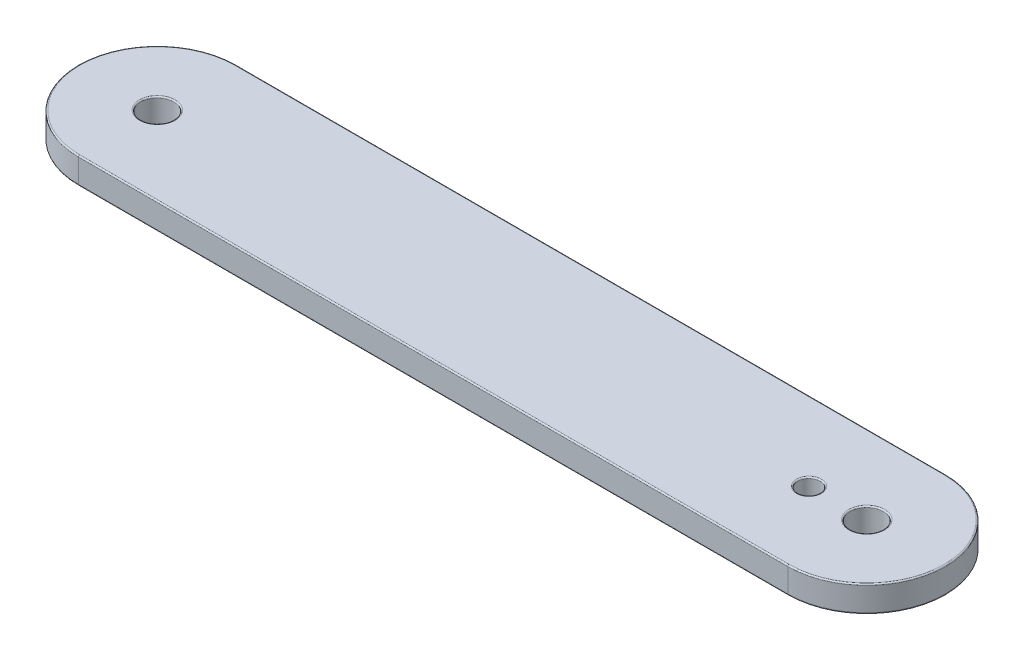
ISO-10303-21;
HEADER;
FILE_DESCRIPTION(('STEP AP214'),'2;1');
FILE_NAME('part.step','',(''),(''),'','','');
FILE_SCHEMA(('AUTOMOTIVE_DESIGN { 1 0 10303 214 1 1 1 1 }'));
ENDSEC;
DATA;
#1=APPLICATION_CONTEXT('core data for automotive mechanical design processes');
#2=APPLICATION_PROTOCOL_DEFINITION('international standard','automotive_design',2000,#1);
#3=PRODUCT_CONTEXT('',#1,'mechanical');
#4=PRODUCT('Part','Part','',(#3));
#5=PRODUCT_RELATED_PRODUCT_CATEGORY('part','',(#4));
#6=PRODUCT_DEFINITION_FORMATION('','',#4);
#7=PRODUCT_DEFINITION_CONTEXT('part definition',#1,'design');
#8=PRODUCT_DEFINITION('design','',#6,#7);
#9=PRODUCT_DEFINITION_SHAPE('','',#8);
#10=(LENGTH_UNIT() NAMED_UNIT(*) SI_UNIT(.MILLI.,.METRE.));
#11=(NAMED_UNIT(*) PLANE_ANGLE_UNIT() SI_UNIT($,.RADIAN.));
#12=(NAMED_UNIT(*) SI_UNIT($,.STERADIAN.) SOLID_ANGLE_UNIT());
#13=UNCERTAINTY_MEASURE_WITH_UNIT(LENGTH_MEASURE(1.E-05),#10,'distance_accuracy_value','');
#14=(GEOMETRIC_REPRESENTATION_CONTEXT(3) GLOBAL_UNCERTAINTY_ASSIGNED_CONTEXT((#13)) GLOBAL_UNIT_ASSIGNED_CONTEXT((#10,
#11,#12)) REPRESENTATION_CONTEXT('',''));
#15=CARTESIAN_POINT('',(0.,0.,0.));
#16=DIRECTION('',(0.,0.,1.));
#17=DIRECTION('',(1.,0.,0.));
#18=AXIS2_PLACEMENT_3D('',#15,#16,#17);
#19=CARTESIAN_POINT('',(0.,6.35,0.));
#20=DIRECTION('',(0.,1.,0.));
#21=DIRECTION('',(0.,0.,1.));
#22=AXIS2_PLACEMENT_3D('',#19,#20,#21);
#23=PLANE('',#22);
#24=CARTESIAN_POINT('',(-13.97,6.35,0.));
#25=DIRECTION('',(0.,1.,0.));
#26=DIRECTION('',(0.,0.,1.));
#27=AXIS2_PLACEMENT_3D('',#24,#25,#26);
#28=CIRCLE('',#27,3.0175);
#29=CARTESIAN_POINT('',(-13.97,6.35,3.0175));
#30=VERTEX_POINT('',#29);
#31=EDGE_CURVE('E130',#30,#30,#28,.F.);
#32=ORIENTED_EDGE('',*,*,#31,.T.);
#33=EDGE_LOOP('',(#32));
#34=FACE_BOUND('',#33,.T.);
#35=CARTESIAN_POINT('',(-171.45,6.35,0.));
#36=DIRECTION('',(0.,1.,0.));
#37=DIRECTION('',(0.,0.,1.));
#38=AXIS2_PLACEMENT_3D('',#35,#36,#37);
#39=CIRCLE('',#38,4.31749999999999);
#40=CARTESIAN_POINT('',(-171.45,6.35,4.31749999999999));
#41=VERTEX_POINT('',#40);
#42=EDGE_CURVE('E127',#41,#41,#39,.F.);
#43=ORIENTED_EDGE('',*,*,#42,.T.);
#44=EDGE_LOOP('',(#43));
#45=FACE_BOUND('',#44,.T.);
#46=CARTESIAN_POINT('',(-171.45,6.35,0.));
#47=DIRECTION('',(0.,1.,0.));
#48=DIRECTION('',(0.,0.,1.));
#49=AXIS2_PLACEMENT_3D('',#46,#47,#48);
#50=CIRCLE('',#49,18.7325);
#51=CARTESIAN_POINT('',(-171.45,6.35,-18.7325));
#52=VERTEX_POINT('',#51);
#53=CARTESIAN_POINT('',(-171.45,6.35,18.7325));
#54=VERTEX_POINT('',#53);
#55=EDGE_CURVE('E125',#52,#54,#50,.T.);
#56=ORIENTED_EDGE('',*,*,#55,.T.);
#57=DIRECTION('',(1.,0.,0.));
#58=VECTOR('',#57,1.);
#59=CARTESIAN_POINT('',(0.,6.35,18.7325));
#60=LINE('',#59,#58);
#61=CARTESIAN_POINT('',(0.,6.35,18.7325));
#62=VERTEX_POINT('',#61);
#63=EDGE_CURVE('E106',#54,#62,#60,.T.);
#64=ORIENTED_EDGE('',*,*,#63,.T.);
#65=CARTESIAN_POINT('',(0.,6.35,0.));
#66=DIRECTION('',(0.,1.,0.));
#67=DIRECTION('',(0.,0.,1.));
#68=AXIS2_PLACEMENT_3D('',#65,#66,#67);
#69=CIRCLE('',#68,18.7325);
#70=CARTESIAN_POINT('',(0.,6.35,-18.7325));
#71=VERTEX_POINT('',#70);
#72=EDGE_CURVE('E114',#62,#71,#69,.T.);
#73=ORIENTED_EDGE('',*,*,#72,.T.);
#74=DIRECTION('',(-1.,0.,0.));
#75=VECTOR('',#74,1.);
#76=CARTESIAN_POINT('',(-171.45,6.35,-18.7325));
#77=LINE('',#76,#75);
#78=EDGE_CURVE('E120',#71,#52,#77,.T.);
#79=ORIENTED_EDGE('',*,*,#78,.T.);
#80=EDGE_LOOP('',(#56,#64,#73,#79));
#81=FACE_BOUND('',#80,.T.);
#82=CARTESIAN_POINT('',(0.,6.35,0.));
#83=DIRECTION('',(0.,1.,0.));
#84=DIRECTION('',(0.,0.,1.));
#85=AXIS2_PLACEMENT_3D('',#82,#83,#84);
#86=CIRCLE('',#85,4.3175);
#87=CARTESIAN_POINT('',(0.,6.35,4.3175));
#88=VERTEX_POINT('',#87);
#89=EDGE_CURVE('E121',#88,#88,#86,.F.);
#90=ORIENTED_EDGE('',*,*,#89,.T.);
#91=EDGE_LOOP('',(#90));
#92=FACE_BOUND('',#91,.T.);
#93=ADVANCED_FACE('F34',(#34,#45,#81,#92),#23,.T.);
#94=CARTESIAN_POINT('',(0.,0.,0.));
#95=DIRECTION('',(0.,1.,0.));
#96=DIRECTION('',(0.,0.,1.));
#97=AXIS2_PLACEMENT_3D('',#94,#95,#96);
#98=PLANE('',#97);
#99=CARTESIAN_POINT('',(-13.97,0.,0.));
#100=DIRECTION('',(0.,1.,0.));
#101=DIRECTION('',(0.,0.,1.));
#102=AXIS2_PLACEMENT_3D('',#99,#100,#101);
#103=CIRCLE('',#102,3.0175);
#104=CARTESIAN_POINT('',(-13.97,0.,3.0175));
#105=VERTEX_POINT('',#104);
#106=EDGE_CURVE('E11',#105,#105,#103,.T.);
#107=ORIENTED_EDGE('',*,*,#106,.T.);
#108=EDGE_LOOP('',(#107));
#109=FACE_BOUND('',#108,.T.);
#110=CARTESIAN_POINT('',(0.,0.,0.));
#111=DIRECTION('',(0.,1.,0.));
#112=DIRECTION('',(0.,0.,1.));
#113=AXIS2_PLACEMENT_3D('',#110,#111,#112);
#114=CIRCLE('',#113,4.3175);
#115=CARTESIAN_POINT('',(0.,0.,4.3175));
#116=VERTEX_POINT('',#115);
#117=EDGE_CURVE('E43',#116,#116,#114,.T.);
#118=ORIENTED_EDGE('',*,*,#117,.T.);
#119=EDGE_LOOP('',(#118));
#120=FACE_BOUND('',#119,.T.);
#121=CARTESIAN_POINT('',(-171.45,0.,0.));
#122=DIRECTION('',(0.,1.,0.));
#123=DIRECTION('',(0.,0.,1.));
#124=AXIS2_PLACEMENT_3D('',#121,#122,#123);
#125=CIRCLE('',#124,4.31749999999999);
#126=CARTESIAN_POINT('',(-171.45,0.,4.31749999999999));
#127=VERTEX_POINT('',#126);
#128=EDGE_CURVE('E171',#127,#127,#125,.T.);
#129=ORIENTED_EDGE('',*,*,#128,.T.);
#130=EDGE_LOOP('',(#129));
#131=FACE_BOUND('',#130,.T.);
#132=CARTESIAN_POINT('',(-171.45,0.,0.));
#133=DIRECTION('',(0.,1.,0.));
#134=DIRECTION('',(0.,0.,1.));
#135=AXIS2_PLACEMENT_3D('',#132,#133,#134);
#136=CIRCLE('',#135,18.7325);
#137=CARTESIAN_POINT('',(-171.45,0.,18.7325));
#138=VERTEX_POINT('',#137);
#139=CARTESIAN_POINT('',(-171.45,0.,-18.7325));
#140=VERTEX_POINT('',#139);
#141=EDGE_CURVE('E51',#138,#140,#136,.F.);
#142=ORIENTED_EDGE('',*,*,#141,.T.);
#143=DIRECTION('',(-1.,0.,0.));
#144=VECTOR('',#143,1.);
#145=CARTESIAN_POINT('',(0.,0.,-18.7325));
#146=LINE('',#145,#144);
#147=CARTESIAN_POINT('',(0.,0.,-18.7325));
#148=VERTEX_POINT('',#147);
#149=EDGE_CURVE('E169',#140,#148,#146,.F.);
#150=ORIENTED_EDGE('',*,*,#149,.T.);
#151=CARTESIAN_POINT('',(0.,0.,0.));
#152=DIRECTION('',(0.,1.,0.));
#153=DIRECTION('',(0.,0.,1.));
#154=AXIS2_PLACEMENT_3D('',#151,#152,#153);
#155=CIRCLE('',#154,18.7325);
#156=CARTESIAN_POINT('',(0.,0.,18.7325));
#157=VERTEX_POINT('',#156);
#158=EDGE_CURVE('E165',#148,#157,#155,.F.);
#159=ORIENTED_EDGE('',*,*,#158,.T.);
#160=DIRECTION('',(1.,0.,0.));
#161=VECTOR('',#160,1.);
#162=CARTESIAN_POINT('',(0.,0.,18.7325));
#163=LINE('',#162,#161);
#164=EDGE_CURVE('E56',#157,#138,#163,.F.);
#165=ORIENTED_EDGE('',*,*,#164,.T.);
#166=EDGE_LOOP('',(#142,#150,#159,#165));
#167=FACE_BOUND('',#166,.T.);
#168=ADVANCED_FACE('F203',(#109,#120,#131,#167),#98,.F.);
#169=CARTESIAN_POINT('',(0.,6.35,0.));
#170=DIRECTION('',(0.,-1.,0.));
#171=DIRECTION('',(0.,0.,-1.));
#172=AXIS2_PLACEMENT_3D('',#169,#170,#171);
#173=CYLINDRICAL_SURFACE('',#172,19.05);
#174=DIRECTION('',(0.,-1.,0.));
#175=VECTOR('',#174,1.);
#176=CARTESIAN_POINT('',(0.,6.35,-19.05));
#177=LINE('',#176,#175);
#178=CARTESIAN_POINT('',(0.,6.0325,-19.05));
#179=VERTEX_POINT('',#178);
#180=CARTESIAN_POINT('',(0.,0.3175,-19.05));
#181=VERTEX_POINT('',#180);
#182=EDGE_CURVE('E439',#179,#181,#177,.T.);
#183=ORIENTED_EDGE('',*,*,#182,.F.);
#184=CARTESIAN_POINT('',(0.,6.0325,0.));
#185=DIRECTION('',(0.,1.,0.));
#186=DIRECTION('',(0.,0.,1.));
#187=AXIS2_PLACEMENT_3D('',#184,#185,#186);
#188=CIRCLE('',#187,19.05);
#189=CARTESIAN_POINT('',(0.,6.0325,19.05));
#190=VERTEX_POINT('',#189);
#191=EDGE_CURVE('E157',#179,#190,#188,.F.);
#192=ORIENTED_EDGE('',*,*,#191,.T.);
#193=DIRECTION('',(0.,-1.,0.));
#194=VECTOR('',#193,1.);
#195=CARTESIAN_POINT('',(0.,6.35,19.05));
#196=LINE('',#195,#194);
#197=CARTESIAN_POINT('',(0.,0.3175,19.05));
#198=VERTEX_POINT('',#197);
#199=EDGE_CURVE('E181',#190,#198,#196,.T.);
#200=ORIENTED_EDGE('',*,*,#199,.T.);
#201=CARTESIAN_POINT('',(0.,0.3175,0.));
#202=DIRECTION('',(0.,1.,0.));
#203=DIRECTION('',(0.,0.,1.));
#204=AXIS2_PLACEMENT_3D('',#201,#202,#203);
#205=CIRCLE('',#204,19.05);
#206=EDGE_CURVE('E155',#198,#181,#205,.T.);
#207=ORIENTED_EDGE('',*,*,#206,.T.);
#208=EDGE_LOOP('',(#183,#192,#200,#207));
#209=FACE_BOUND('',#208,.T.);
#210=ADVANCED_FACE('F205',(#209),#173,.T.);
#211=CARTESIAN_POINT('',(0.,6.35,-19.05));
#212=DIRECTION('',(0.,0.,1.));
#213=DIRECTION('',(1.,0.,0.));
#214=AXIS2_PLACEMENT_3D('',#211,#212,#213);
#215=PLANE('',#214);
#216=DIRECTION('',(0.,-1.,0.));
#217=VECTOR('',#216,1.);
#218=CARTESIAN_POINT('',(-171.45,6.35,-19.05));
#219=LINE('',#218,#217);
#220=CARTESIAN_POINT('',(-171.45,6.0325,-19.05));
#221=VERTEX_POINT('',#220);
#222=CARTESIAN_POINT('',(-171.45,0.3175,-19.05));
#223=VERTEX_POINT('',#222);
#224=EDGE_CURVE('E443',#221,#223,#219,.T.);
#225=ORIENTED_EDGE('',*,*,#224,.F.);
#226=DIRECTION('',(-1.,0.,0.));
#227=VECTOR('',#226,1.);
#228=CARTESIAN_POINT('',(0.,6.0325,-19.05));
#229=LINE('',#228,#227);
#230=EDGE_CURVE('E153',#221,#179,#229,.F.);
#231=ORIENTED_EDGE('',*,*,#230,.T.);
#232=ORIENTED_EDGE('',*,*,#182,.T.);
#233=DIRECTION('',(-1.,0.,0.));
#234=VECTOR('',#233,1.);
#235=CARTESIAN_POINT('',(0.,0.3175,-19.05));
#236=LINE('',#235,#234);
#237=EDGE_CURVE('E150',#181,#223,#236,.T.);
#238=ORIENTED_EDGE('',*,*,#237,.T.);
#239=EDGE_LOOP('',(#225,#231,#232,#238));
#240=FACE_BOUND('',#239,.T.);
#241=ADVANCED_FACE('F212',(#240),#215,.F.);
#242=CARTESIAN_POINT('',(-171.45,6.35,0.));
#243=DIRECTION('',(0.,-1.,0.));
#244=DIRECTION('',(0.,0.,-1.));
#245=AXIS2_PLACEMENT_3D('',#242,#243,#244);
#246=CYLINDRICAL_SURFACE('',#245,19.05);
#247=DIRECTION('',(0.,-1.,0.));
#248=VECTOR('',#247,1.);
#249=CARTESIAN_POINT('',(-171.45,6.35,19.05));
#250=LINE('',#249,#248);
#251=CARTESIAN_POINT('',(-171.45,6.0325,19.05));
#252=VERTEX_POINT('',#251);
#253=CARTESIAN_POINT('',(-171.45,0.3175,19.05));
#254=VERTEX_POINT('',#253);
#255=EDGE_CURVE('E456',#252,#254,#250,.T.);
#256=ORIENTED_EDGE('',*,*,#255,.F.);
#257=CARTESIAN_POINT('',(-171.45,6.0325,0.));
#258=DIRECTION('',(0.,1.,0.));
#259=DIRECTION('',(0.,0.,1.));
#260=AXIS2_PLACEMENT_3D('',#257,#258,#259);
#261=CIRCLE('',#260,19.05);
#262=EDGE_CURVE('E148',#252,#221,#261,.F.);
#263=ORIENTED_EDGE('',*,*,#262,.T.);
#264=ORIENTED_EDGE('',*,*,#224,.T.);
#265=CARTESIAN_POINT('',(-171.45,0.3175,0.));
#266=DIRECTION('',(0.,1.,0.));
#267=DIRECTION('',(0.,0.,1.));
#268=AXIS2_PLACEMENT_3D('',#265,#266,#267);
#269=CIRCLE('',#268,19.05);
#270=EDGE_CURVE('E146',#223,#254,#269,.T.);
#271=ORIENTED_EDGE('',*,*,#270,.T.);
#272=EDGE_LOOP('',(#256,#263,#264,#271));
#273=FACE_BOUND('',#272,.T.);
#274=ADVANCED_FACE('F224',(#273),#246,.T.);
#275=CARTESIAN_POINT('',(0.,6.35,19.05));
#276=DIRECTION('',(0.,0.,-1.));
#277=DIRECTION('',(-1.,0.,0.));
#278=AXIS2_PLACEMENT_3D('',#275,#276,#277);
#279=PLANE('',#278);
#280=ORIENTED_EDGE('',*,*,#199,.F.);
#281=DIRECTION('',(1.,0.,0.));
#282=VECTOR('',#281,1.);
#283=CARTESIAN_POINT('',(-171.45,6.0325,19.05));
#284=LINE('',#283,#282);
#285=EDGE_CURVE('E108',#190,#252,#284,.F.);
#286=ORIENTED_EDGE('',*,*,#285,.T.);
#287=ORIENTED_EDGE('',*,*,#255,.T.);
#288=DIRECTION('',(1.,0.,0.));
#289=VECTOR('',#288,1.);
#290=CARTESIAN_POINT('',(0.,0.3175,19.05));
#291=LINE('',#290,#289);
#292=EDGE_CURVE('E143',#254,#198,#291,.T.);
#293=ORIENTED_EDGE('',*,*,#292,.T.);
#294=EDGE_LOOP('',(#280,#286,#287,#293));
#295=FACE_BOUND('',#294,.T.);
#296=ADVANCED_FACE('F220',(#295),#279,.F.);
#297=CARTESIAN_POINT('',(-171.45,6.35,0.));
#298=DIRECTION('',(0.,-1.,0.));
#299=DIRECTION('',(0.,0.,-1.));
#300=AXIS2_PLACEMENT_3D('',#297,#298,#299);
#301=CYLINDRICAL_SURFACE('',#300,3.99999999999999);
#302=CARTESIAN_POINT('',(-171.45,6.0325,0.));
#303=DIRECTION('',(0.,1.,0.));
#304=DIRECTION('',(0.,0.,1.));
#305=AXIS2_PLACEMENT_3D('',#302,#303,#304);
#306=CIRCLE('',#305,3.99999999999999);
#307=CARTESIAN_POINT('',(-171.45,6.0325,3.99999999999999));
#308=VERTEX_POINT('',#307);
#309=EDGE_CURVE('E140',#308,#308,#306,.T.);
#310=ORIENTED_EDGE('',*,*,#309,.T.);
#311=EDGE_LOOP('',(#310));
#312=FACE_BOUND('',#311,.T.);
#313=CARTESIAN_POINT('',(-171.45,0.3175,0.));
#314=DIRECTION('',(0.,1.,0.));
#315=DIRECTION('',(0.,0.,1.));
#316=AXIS2_PLACEMENT_3D('',#313,#314,#315);
#317=CIRCLE('',#316,3.99999999999999);
#318=CARTESIAN_POINT('',(-171.45,0.3175,3.99999999999999));
#319=VERTEX_POINT('',#318);
#320=EDGE_CURVE('E137',#319,#319,#317,.F.);
#321=ORIENTED_EDGE('',*,*,#320,.T.);
#322=EDGE_LOOP('',(#321));
#323=FACE_BOUND('',#322,.T.);
#324=ADVANCED_FACE('F223',(#312,#323),#301,.F.);
#325=CARTESIAN_POINT('',(0.,6.35,0.));
#326=DIRECTION('',(0.,-1.,0.));
#327=DIRECTION('',(0.,0.,-1.));
#328=AXIS2_PLACEMENT_3D('',#325,#326,#327);
#329=CYLINDRICAL_SURFACE('',#328,4.);
#330=CARTESIAN_POINT('',(0.,6.0325,0.));
#331=DIRECTION('',(0.,1.,0.));
#332=DIRECTION('',(0.,0.,1.));
#333=AXIS2_PLACEMENT_3D('',#330,#331,#332);
#334=CIRCLE('',#333,4.);
#335=CARTESIAN_POINT('',(0.,6.0325,4.));
#336=VERTEX_POINT('',#335);
#337=EDGE_CURVE('E162',#336,#336,#334,.T.);
#338=ORIENTED_EDGE('',*,*,#337,.T.);
#339=EDGE_LOOP('',(#338));
#340=FACE_BOUND('',#339,.T.);
#341=CARTESIAN_POINT('',(0.,0.3175,0.));
#342=DIRECTION('',(0.,1.,0.));
#343=DIRECTION('',(0.,0.,1.));
#344=AXIS2_PLACEMENT_3D('',#341,#342,#343);
#345=CIRCLE('',#344,4.);
#346=CARTESIAN_POINT('',(0.,0.3175,4.));
#347=VERTEX_POINT('',#346);
#348=EDGE_CURVE('E159',#347,#347,#345,.F.);
#349=ORIENTED_EDGE('',*,*,#348,.T.);
#350=EDGE_LOOP('',(#349));
#351=FACE_BOUND('',#350,.T.);
#352=ADVANCED_FACE('F324',(#340,#351),#329,.F.);
#353=CARTESIAN_POINT('',(-13.97,6.35,0.));
#354=DIRECTION('',(0.,-1.,0.));
#355=DIRECTION('',(0.,0.,-1.));
#356=AXIS2_PLACEMENT_3D('',#353,#354,#355);
#357=CYLINDRICAL_SURFACE('',#356,2.7);
#358=CARTESIAN_POINT('',(-13.97,6.0325,0.));
#359=DIRECTION('',(0.,1.,0.));
#360=DIRECTION('',(0.,0.,1.));
#361=AXIS2_PLACEMENT_3D('',#358,#359,#360);
#362=CIRCLE('',#361,2.7);
#363=CARTESIAN_POINT('',(-13.97,6.0325,2.7));
#364=VERTEX_POINT('',#363);
#365=EDGE_CURVE('E435',#364,#364,#362,.T.);
#366=ORIENTED_EDGE('',*,*,#365,.T.);
#367=EDGE_LOOP('',(#366));
#368=FACE_BOUND('',#367,.T.);
#369=CARTESIAN_POINT('',(-13.97,0.3175,0.));
#370=DIRECTION('',(0.,1.,0.));
#371=DIRECTION('',(0.,0.,1.));
#372=AXIS2_PLACEMENT_3D('',#369,#370,#371);
#373=CIRCLE('',#372,2.7);
#374=CARTESIAN_POINT('',(-13.97,0.3175,2.7));
#375=VERTEX_POINT('',#374);
#376=EDGE_CURVE('E438',#375,#375,#373,.F.);
#377=ORIENTED_EDGE('',*,*,#376,.T.);
#378=EDGE_LOOP('',(#377));
#379=FACE_BOUND('',#378,.T.);
#380=ADVANCED_FACE('F236',(#368,#379),#357,.F.);
#381=CARTESIAN_POINT('',(-13.97,6.0325,0.));
#382=DIRECTION('',(0.,1.,0.));
#383=DIRECTION('',(0.,0.,1.));
#384=AXIS2_PLACEMENT_3D('',#381,#382,#383);
#385=TOROIDAL_SURFACE('',#384,3.0175,0.3175);
#386=ORIENTED_EDGE('',*,*,#31,.F.);
#387=EDGE_LOOP('',(#386));
#388=FACE_BOUND('',#387,.T.);
#389=ORIENTED_EDGE('',*,*,#365,.F.);
#390=EDGE_LOOP('',(#389));
#391=FACE_BOUND('',#390,.T.);
#392=ADVANCED_FACE('F232',(#388,#391),#385,.T.);
#393=CARTESIAN_POINT('',(-171.45,6.0325,0.));
#394=DIRECTION('',(0.,1.,0.));
#395=DIRECTION('',(0.,0.,1.));
#396=AXIS2_PLACEMENT_3D('',#393,#394,#395);
#397=TOROIDAL_SURFACE('',#396,4.31749999999999,0.3175);
#398=ORIENTED_EDGE('',*,*,#42,.F.);
#399=EDGE_LOOP('',(#398));
#400=FACE_BOUND('',#399,.T.);
#401=ORIENTED_EDGE('',*,*,#309,.F.);
#402=EDGE_LOOP('',(#401));
#403=FACE_BOUND('',#402,.T.);
#404=ADVANCED_FACE('F235',(#400,#403),#397,.T.);
#405=CARTESIAN_POINT('',(0.,6.0325,-18.7325));
#406=DIRECTION('',(1.,0.,0.));
#407=DIRECTION('',(0.,0.,-1.));
#408=AXIS2_PLACEMENT_3D('',#405,#406,#407);
#409=CYLINDRICAL_SURFACE('',#408,0.3175);
#410=CARTESIAN_POINT('',(0.,6.0325,-18.7325));
#411=DIRECTION('',(1.,0.,0.));
#412=DIRECTION('',(0.,0.,-1.));
#413=AXIS2_PLACEMENT_3D('',#410,#411,#412);
#414=CIRCLE('',#413,0.3175);
#415=EDGE_CURVE('E117',#179,#71,#414,.T.);
#416=ORIENTED_EDGE('',*,*,#415,.F.);
#417=ORIENTED_EDGE('',*,*,#230,.F.);
#418=CARTESIAN_POINT('',(-171.45,6.0325,-18.7325));
#419=DIRECTION('',(-1.,0.,0.));
#420=DIRECTION('',(0.,0.,1.));
#421=AXIS2_PLACEMENT_3D('',#418,#419,#420);
#422=CIRCLE('',#421,0.3175);
#423=EDGE_CURVE('E178',#52,#221,#422,.T.);
#424=ORIENTED_EDGE('',*,*,#423,.F.);
#425=ORIENTED_EDGE('',*,*,#78,.F.);
#426=EDGE_LOOP('',(#416,#417,#424,#425));
#427=FACE_BOUND('',#426,.T.);
#428=ADVANCED_FACE('F240',(#427),#409,.T.);
#429=CARTESIAN_POINT('',(-171.45,6.0325,0.));
#430=DIRECTION('',(0.,1.,0.));
#431=DIRECTION('',(0.,0.,1.));
#432=AXIS2_PLACEMENT_3D('',#429,#430,#431);
#433=TOROIDAL_SURFACE('',#432,18.7325,0.3175);
#434=ORIENTED_EDGE('',*,*,#423,.T.);
#435=ORIENTED_EDGE('',*,*,#262,.F.);
#436=CARTESIAN_POINT('',(-171.45,6.0325,18.7325));
#437=DIRECTION('',(1.,0.,0.));
#438=DIRECTION('',(0.,0.,-1.));
#439=AXIS2_PLACEMENT_3D('',#436,#437,#438);
#440=CIRCLE('',#439,0.3175);
#441=EDGE_CURVE('E111',#54,#252,#440,.T.);
#442=ORIENTED_EDGE('',*,*,#441,.F.);
#443=ORIENTED_EDGE('',*,*,#55,.F.);
#444=EDGE_LOOP('',(#434,#435,#442,#443));
#445=FACE_BOUND('',#444,.T.);
#446=ADVANCED_FACE('F247',(#445),#433,.T.);
#447=CARTESIAN_POINT('',(0.,6.0325,0.));
#448=DIRECTION('',(0.,1.,0.));
#449=DIRECTION('',(0.,0.,1.));
#450=AXIS2_PLACEMENT_3D('',#447,#448,#449);
#451=TOROIDAL_SURFACE('',#450,18.7325,0.3175);
#452=ORIENTED_EDGE('',*,*,#415,.T.);
#453=ORIENTED_EDGE('',*,*,#72,.F.);
#454=CARTESIAN_POINT('',(0.,6.0325,18.7325));
#455=DIRECTION('',(-1.,0.,0.));
#456=DIRECTION('',(0.,0.,1.));
#457=AXIS2_PLACEMENT_3D('',#454,#455,#456);
#458=CIRCLE('',#457,0.3175);
#459=EDGE_CURVE('E102',#190,#62,#458,.T.);
#460=ORIENTED_EDGE('',*,*,#459,.F.);
#461=ORIENTED_EDGE('',*,*,#191,.F.);
#462=EDGE_LOOP('',(#452,#453,#460,#461));
#463=FACE_BOUND('',#462,.T.);
#464=ADVANCED_FACE('F115',(#463),#451,.T.);
#465=CARTESIAN_POINT('',(0.,6.0325,18.7325));
#466=DIRECTION('',(-1.,0.,0.));
#467=DIRECTION('',(0.,0.,1.));
#468=AXIS2_PLACEMENT_3D('',#465,#466,#467);
#469=CYLINDRICAL_SURFACE('',#468,0.3175);
#470=ORIENTED_EDGE('',*,*,#441,.T.);
#471=ORIENTED_EDGE('',*,*,#285,.F.);
#472=ORIENTED_EDGE('',*,*,#459,.T.);
#473=ORIENTED_EDGE('',*,*,#63,.F.);
#474=EDGE_LOOP('',(#470,#471,#472,#473));
#475=FACE_BOUND('',#474,.T.);
#476=ADVANCED_FACE('F104',(#475),#469,.T.);
#477=CARTESIAN_POINT('',(0.,6.0325,0.));
#478=DIRECTION('',(0.,1.,0.));
#479=DIRECTION('',(0.,0.,1.));
#480=AXIS2_PLACEMENT_3D('',#477,#478,#479);
#481=TOROIDAL_SURFACE('',#480,4.3175,0.3175);
#482=ORIENTED_EDGE('',*,*,#89,.F.);
#483=EDGE_LOOP('',(#482));
#484=FACE_BOUND('',#483,.T.);
#485=ORIENTED_EDGE('',*,*,#337,.F.);
#486=EDGE_LOOP('',(#485));
#487=FACE_BOUND('',#486,.T.);
#488=ADVANCED_FACE('F244',(#484,#487),#481,.T.);
#489=CARTESIAN_POINT('',(-13.97,0.3175,0.));
#490=DIRECTION('',(0.,1.,0.));
#491=DIRECTION('',(0.,0.,1.));
#492=AXIS2_PLACEMENT_3D('',#489,#490,#491);
#493=TOROIDAL_SURFACE('',#492,3.0175,0.3175);
#494=ORIENTED_EDGE('',*,*,#376,.F.);
#495=EDGE_LOOP('',(#494));
#496=FACE_BOUND('',#495,.T.);
#497=ORIENTED_EDGE('',*,*,#106,.F.);
#498=EDGE_LOOP('',(#497));
#499=FACE_BOUND('',#498,.T.);
#500=ADVANCED_FACE('F256',(#496,#499),#493,.T.);
#501=CARTESIAN_POINT('',(0.,0.3175,0.));
#502=DIRECTION('',(0.,1.,0.));
#503=DIRECTION('',(0.,0.,1.));
#504=AXIS2_PLACEMENT_3D('',#501,#502,#503);
#505=TOROIDAL_SURFACE('',#504,4.3175,0.3175);
#506=ORIENTED_EDGE('',*,*,#348,.F.);
#507=EDGE_LOOP('',(#506));
#508=FACE_BOUND('',#507,.T.);
#509=ORIENTED_EDGE('',*,*,#117,.F.);
#510=EDGE_LOOP('',(#509));
#511=FACE_BOUND('',#510,.T.);
#512=ADVANCED_FACE('F260',(#508,#511),#505,.T.);
#513=CARTESIAN_POINT('',(-171.45,0.3175,0.));
#514=DIRECTION('',(0.,1.,0.));
#515=DIRECTION('',(0.,0.,1.));
#516=AXIS2_PLACEMENT_3D('',#513,#514,#515);
#517=TOROIDAL_SURFACE('',#516,4.31749999999999,0.3175);
#518=ORIENTED_EDGE('',*,*,#320,.F.);
#519=EDGE_LOOP('',(#518));
#520=FACE_BOUND('',#519,.T.);
#521=ORIENTED_EDGE('',*,*,#128,.F.);
#522=EDGE_LOOP('',(#521));
#523=FACE_BOUND('',#522,.T.);
#524=ADVANCED_FACE('F264',(#520,#523),#517,.T.);
#525=CARTESIAN_POINT('',(0.,0.3175,18.7325));
#526=DIRECTION('',(1.,0.,0.));
#527=DIRECTION('',(0.,0.,-1.));
#528=AXIS2_PLACEMENT_3D('',#525,#526,#527);
#529=CYLINDRICAL_SURFACE('',#528,0.3175);
#530=CARTESIAN_POINT('',(-171.45,0.3175,18.7325));
#531=DIRECTION('',(-1.,0.,0.));
#532=DIRECTION('',(0.,0.,1.));
#533=AXIS2_PLACEMENT_3D('',#530,#531,#532);
#534=CIRCLE('',#533,0.3175);
#535=EDGE_CURVE('E185',#138,#254,#534,.T.);
#536=ORIENTED_EDGE('',*,*,#535,.F.);
#537=ORIENTED_EDGE('',*,*,#164,.F.);
#538=CARTESIAN_POINT('',(0.,0.3175,18.7325));
#539=DIRECTION('',(1.,0.,0.));
#540=DIRECTION('',(0.,0.,-1.));
#541=AXIS2_PLACEMENT_3D('',#538,#539,#540);
#542=CIRCLE('',#541,0.3175);
#543=EDGE_CURVE('E38',#198,#157,#542,.T.);
#544=ORIENTED_EDGE('',*,*,#543,.F.);
#545=ORIENTED_EDGE('',*,*,#292,.F.);
#546=EDGE_LOOP('',(#536,#537,#544,#545));
#547=FACE_BOUND('',#546,.T.);
#548=ADVANCED_FACE('F36',(#547),#529,.T.);
#549=CARTESIAN_POINT('',(0.,0.3175,0.));
#550=DIRECTION('',(0.,1.,0.));
#551=DIRECTION('',(0.,0.,1.));
#552=AXIS2_PLACEMENT_3D('',#549,#550,#551);
#553=TOROIDAL_SURFACE('',#552,18.7325,0.3175);
#554=ORIENTED_EDGE('',*,*,#543,.T.);
#555=ORIENTED_EDGE('',*,*,#158,.F.);
#556=CARTESIAN_POINT('',(0.,0.3175,-18.7325));
#557=DIRECTION('',(-1.,0.,0.));
#558=DIRECTION('',(0.,0.,1.));
#559=AXIS2_PLACEMENT_3D('',#556,#557,#558);
#560=CIRCLE('',#559,0.3175);
#561=EDGE_CURVE('E184',#181,#148,#560,.T.);
#562=ORIENTED_EDGE('',*,*,#561,.F.);
#563=ORIENTED_EDGE('',*,*,#206,.F.);
#564=EDGE_LOOP('',(#554,#555,#562,#563));
#565=FACE_BOUND('',#564,.T.);
#566=ADVANCED_FACE('F194',(#565),#553,.T.);
#567=CARTESIAN_POINT('',(-171.45,0.3175,0.));
#568=DIRECTION('',(0.,1.,0.));
#569=DIRECTION('',(0.,0.,1.));
#570=AXIS2_PLACEMENT_3D('',#567,#568,#569);
#571=TOROIDAL_SURFACE('',#570,18.7325,0.3175);
#572=ORIENTED_EDGE('',*,*,#535,.T.);
#573=ORIENTED_EDGE('',*,*,#270,.F.);
#574=CARTESIAN_POINT('',(-171.45,0.3175,-18.7325));
#575=DIRECTION('',(1.,0.,0.));
#576=DIRECTION('',(0.,0.,-1.));
#577=AXIS2_PLACEMENT_3D('',#574,#575,#576);
#578=CIRCLE('',#577,0.3175);
#579=EDGE_CURVE('E182',#140,#223,#578,.T.);
#580=ORIENTED_EDGE('',*,*,#579,.F.);
#581=ORIENTED_EDGE('',*,*,#141,.F.);
#582=EDGE_LOOP('',(#572,#573,#580,#581));
#583=FACE_BOUND('',#582,.T.);
#584=ADVANCED_FACE('F199',(#583),#571,.T.);
#585=CARTESIAN_POINT('',(0.,0.3175,-18.7325));
#586=DIRECTION('',(-1.,0.,0.));
#587=DIRECTION('',(0.,0.,1.));
#588=AXIS2_PLACEMENT_3D('',#585,#586,#587);
#589=CYLINDRICAL_SURFACE('',#588,0.3175);
#590=ORIENTED_EDGE('',*,*,#561,.T.);
#591=ORIENTED_EDGE('',*,*,#149,.F.);
#592=ORIENTED_EDGE('',*,*,#579,.T.);
#593=ORIENTED_EDGE('',*,*,#237,.F.);
#594=EDGE_LOOP('',(#590,#591,#592,#593));
#595=FACE_BOUND('',#594,.T.);
#596=ADVANCED_FACE('F202',(#595),#589,.T.);
#597=CLOSED_SHELL('',(#93,#168,#210,#241,#274,#296,#324,#352,#380,#392,#404,#428,#446,#464,#476,
#488,#500,#512,#524,#548,#566,#584,#596));
#598=MANIFOLD_SOLID_BREP('B2',#597);
#599=ADVANCED_BREP_SHAPE_REPRESENTATION('',(#18,#598),#14);
#600=SHAPE_DEFINITION_REPRESENTATION(#9,#599);
ENDSEC;
END-ISO-10303-21;
